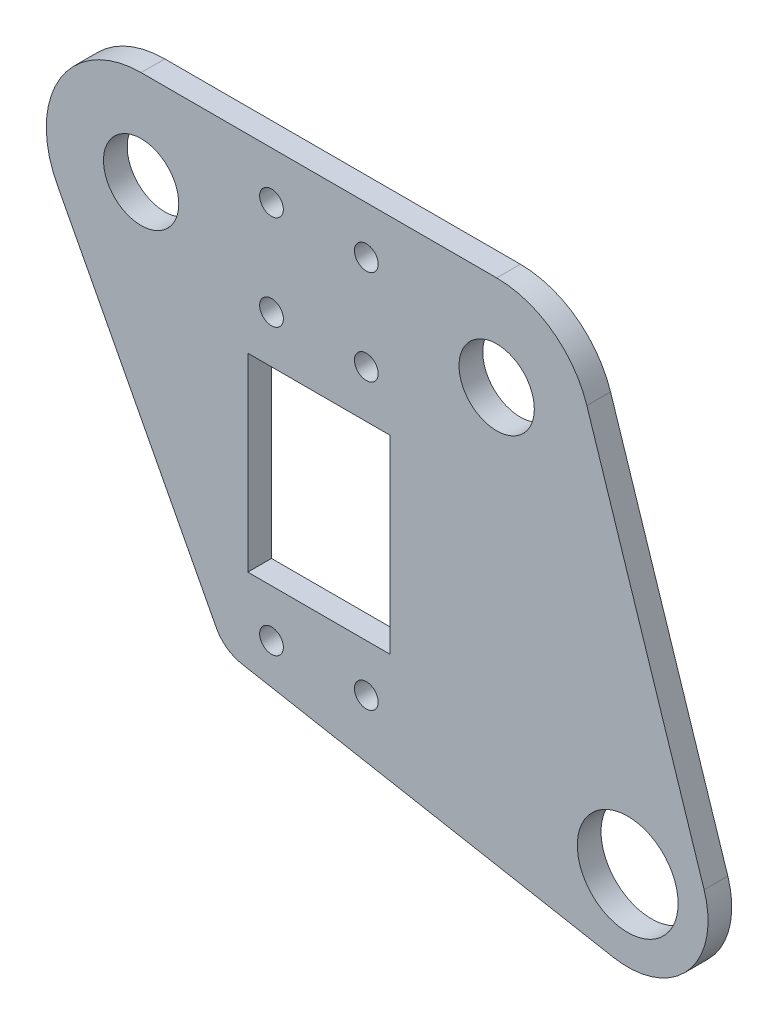
ISO-10303-21;
HEADER;
FILE_DESCRIPTION(('STEP AP214'),'2;1');
FILE_NAME('part.step','',(''),(''),'','','');
FILE_SCHEMA(('AUTOMOTIVE_DESIGN { 1 0 10303 214 1 1 1 1 }'));
ENDSEC;
DATA;
#1=APPLICATION_CONTEXT('core data for automotive mechanical design processes');
#2=APPLICATION_PROTOCOL_DEFINITION('international standard','automotive_design',2000,#1);
#3=PRODUCT_CONTEXT('',#1,'mechanical');
#4=PRODUCT('Part','Part','',(#3));
#5=PRODUCT_RELATED_PRODUCT_CATEGORY('part','',(#4));
#6=PRODUCT_DEFINITION_FORMATION('','',#4);
#7=PRODUCT_DEFINITION_CONTEXT('part definition',#1,'design');
#8=PRODUCT_DEFINITION('design','',#6,#7);
#9=PRODUCT_DEFINITION_SHAPE('','',#8);
#10=(LENGTH_UNIT() NAMED_UNIT(*) SI_UNIT(.MILLI.,.METRE.));
#11=(NAMED_UNIT(*) PLANE_ANGLE_UNIT() SI_UNIT($,.RADIAN.));
#12=(NAMED_UNIT(*) SI_UNIT($,.STERADIAN.) SOLID_ANGLE_UNIT());
#13=UNCERTAINTY_MEASURE_WITH_UNIT(LENGTH_MEASURE(1.E-05),#10,'distance_accuracy_value','');
#14=(GEOMETRIC_REPRESENTATION_CONTEXT(3) GLOBAL_UNCERTAINTY_ASSIGNED_CONTEXT((#13)) GLOBAL_UNIT_ASSIGNED_CONTEXT((#10,
#11,#12)) REPRESENTATION_CONTEXT('',''));
#15=CARTESIAN_POINT('',(0.,0.,0.));
#16=DIRECTION('',(0.,0.,1.));
#17=DIRECTION('',(1.,0.,0.));
#18=AXIS2_PLACEMENT_3D('',#15,#16,#17);
#19=CARTESIAN_POINT('',(-23.8125,0.,3.175));
#20=DIRECTION('',(0.,0.,1.));
#21=DIRECTION('',(1.,0.,0.));
#22=AXIS2_PLACEMENT_3D('',#19,#20,#21);
#23=PLANE('',#22);
#24=CARTESIAN_POINT('',(6.35,-6.35,3.175));
#25=DIRECTION('',(0.,0.,1.));
#26=DIRECTION('',(1.,0.,0.));
#27=AXIS2_PLACEMENT_3D('',#24,#25,#26);
#28=CIRCLE('',#27,1.5875);
#29=CARTESIAN_POINT('',(7.9375,-6.35,3.175));
#30=VERTEX_POINT('',#29);
#31=EDGE_CURVE('E331',#30,#30,#28,.T.);
#32=ORIENTED_EDGE('',*,*,#31,.F.);
#33=EDGE_LOOP('',(#32));
#34=FACE_BOUND('',#33,.T.);
#35=CARTESIAN_POINT('',(-6.35,6.35,3.175));
#36=DIRECTION('',(0.,0.,1.));
#37=DIRECTION('',(1.,0.,0.));
#38=AXIS2_PLACEMENT_3D('',#35,#36,#37);
#39=CIRCLE('',#38,1.5875);
#40=CARTESIAN_POINT('',(-4.7625,6.35,3.175));
#41=VERTEX_POINT('',#40);
#42=EDGE_CURVE('E333',#41,#41,#39,.T.);
#43=ORIENTED_EDGE('',*,*,#42,.F.);
#44=EDGE_LOOP('',(#43));
#45=FACE_BOUND('',#44,.T.);
#46=CARTESIAN_POINT('',(-6.35,-6.35,3.175));
#47=DIRECTION('',(0.,0.,1.));
#48=DIRECTION('',(1.,0.,0.));
#49=AXIS2_PLACEMENT_3D('',#46,#47,#48);
#50=CIRCLE('',#49,1.5875);
#51=CARTESIAN_POINT('',(-4.7625,-6.35,3.175));
#52=VERTEX_POINT('',#51);
#53=EDGE_CURVE('E341',#52,#52,#50,.T.);
#54=ORIENTED_EDGE('',*,*,#53,.F.);
#55=EDGE_LOOP('',(#54));
#56=FACE_BOUND('',#55,.T.);
#57=CARTESIAN_POINT('',(6.35,6.35,3.175));
#58=DIRECTION('',(0.,0.,1.));
#59=DIRECTION('',(1.,0.,0.));
#60=AXIS2_PLACEMENT_3D('',#57,#58,#59);
#61=CIRCLE('',#60,1.5875);
#62=CARTESIAN_POINT('',(7.9375,6.35,3.175));
#63=VERTEX_POINT('',#62);
#64=EDGE_CURVE('E347',#63,#63,#61,.T.);
#65=ORIENTED_EDGE('',*,*,#64,.F.);
#66=EDGE_LOOP('',(#65));
#67=FACE_BOUND('',#66,.T.);
#68=CARTESIAN_POINT('',(-6.35,-44.45,3.175));
#69=DIRECTION('',(0.,0.,1.));
#70=DIRECTION('',(1.,0.,0.));
#71=AXIS2_PLACEMENT_3D('',#68,#69,#70);
#72=CIRCLE('',#71,1.5875);
#73=CARTESIAN_POINT('',(-4.7625,-44.45,3.175));
#74=VERTEX_POINT('',#73);
#75=EDGE_CURVE('E353',#74,#74,#72,.T.);
#76=ORIENTED_EDGE('',*,*,#75,.F.);
#77=EDGE_LOOP('',(#76));
#78=FACE_BOUND('',#77,.T.);
#79=CARTESIAN_POINT('',(6.35,-44.45,3.175));
#80=DIRECTION('',(0.,0.,1.));
#81=DIRECTION('',(1.,0.,0.));
#82=AXIS2_PLACEMENT_3D('',#79,#80,#81);
#83=CIRCLE('',#82,1.5875);
#84=CARTESIAN_POINT('',(7.9375,-44.45,3.175));
#85=VERTEX_POINT('',#84);
#86=EDGE_CURVE('E359',#85,#85,#83,.T.);
#87=ORIENTED_EDGE('',*,*,#86,.F.);
#88=EDGE_LOOP('',(#87));
#89=FACE_BOUND('',#88,.T.);
#90=CARTESIAN_POINT('',(41.3639,-47.7139,3.175));
#91=DIRECTION('',(0.,0.,1.));
#92=DIRECTION('',(1.,0.,0.));
#93=AXIS2_PLACEMENT_3D('',#90,#91,#92);
#94=CIRCLE('',#93,6.75);
#95=CARTESIAN_POINT('',(48.1139,-47.7139,3.175));
#96=VERTEX_POINT('',#95);
#97=EDGE_CURVE('E365',#96,#96,#94,.T.);
#98=ORIENTED_EDGE('',*,*,#97,.F.);
#99=EDGE_LOOP('',(#98));
#100=FACE_BOUND('',#99,.T.);
#101=CARTESIAN_POINT('',(-23.8125,0.,3.175));
#102=DIRECTION('',(0.,0.,1.));
#103=DIRECTION('',(1.,0.,0.));
#104=AXIS2_PLACEMENT_3D('',#101,#102,#103);
#105=CIRCLE('',#104,5.0419);
#106=CARTESIAN_POINT('',(-18.7706,0.,3.175));
#107=VERTEX_POINT('',#106);
#108=EDGE_CURVE('E371',#107,#107,#105,.T.);
#109=ORIENTED_EDGE('',*,*,#108,.F.);
#110=EDGE_LOOP('',(#109));
#111=FACE_BOUND('',#110,.T.);
#112=CARTESIAN_POINT('',(23.8125,0.,3.175));
#113=DIRECTION('',(0.,0.,1.));
#114=DIRECTION('',(1.,0.,0.));
#115=AXIS2_PLACEMENT_3D('',#112,#113,#114);
#116=CIRCLE('',#115,5.0419);
#117=CARTESIAN_POINT('',(28.8544,0.,3.175));
#118=VERTEX_POINT('',#117);
#119=EDGE_CURVE('E377',#118,#118,#116,.T.);
#120=ORIENTED_EDGE('',*,*,#119,.F.);
#121=EDGE_LOOP('',(#120));
#122=FACE_BOUND('',#121,.T.);
#123=CARTESIAN_POINT('',(-23.8125,0.,3.175));
#124=DIRECTION('',(0.,0.,1.));
#125=DIRECTION('',(1.,0.,0.));
#126=AXIS2_PLACEMENT_3D('',#123,#124,#125);
#127=CIRCLE('',#126,12.7);
#128=CARTESIAN_POINT('',(-23.8125,12.7,3.175));
#129=VERTEX_POINT('',#128);
#130=CARTESIAN_POINT('',(-35.0665660599883,-5.88523551928197,3.175));
#131=VERTEX_POINT('',#130);
#132=EDGE_CURVE('E159',#129,#131,#127,.T.);
#133=ORIENTED_EDGE('',*,*,#132,.T.);
#134=DIRECTION('',(0.463404371597006,-0.886146933857351,0.));
#135=VECTOR('',#134,1.);
#136=CARTESIAN_POINT('',(-35.0665660599883,-5.88523551928197,3.175));
#137=LINE('',#136,#135);
#138=CARTESIAN_POINT('',(-13.7452747724956,-46.6569633197307,3.175));
#139=VERTEX_POINT('',#138);
#140=EDGE_CURVE('E162',#131,#139,#137,.T.);
#141=ORIENTED_EDGE('',*,*,#140,.T.);
#142=CARTESIAN_POINT('',(-9.52499999999999,-44.45,3.175));
#143=DIRECTION('',(0.,0.,1.));
#144=DIRECTION('',(1.,0.,0.));
#145=AXIS2_PLACEMENT_3D('',#142,#143,#144);
#146=CIRCLE('',#145,4.7625);
#147=CARTESIAN_POINT('',(-10.3869292158251,-49.1338535712496,3.175));
#148=VERTEX_POINT('',#147);
#149=EDGE_CURVE('E165',#139,#148,#146,.T.);
#150=ORIENTED_EDGE('',*,*,#149,.T.);
#151=DIRECTION('',(0.983486314173133,-0.180982512509205,0.));
#152=VECTOR('',#151,1.);
#153=CARTESIAN_POINT('',(-10.3869292158251,-49.1338535712496,3.175));
#154=LINE('',#153,#152);
#155=CARTESIAN_POINT('',(39.4160757091197,-58.2986714562884,3.175));
#156=VERTEX_POINT('',#155);
#157=EDGE_CURVE('E167',#148,#156,#154,.T.);
#158=ORIENTED_EDGE('',*,*,#157,.T.);
#159=CARTESIAN_POINT('',(41.3639,-47.7139,3.175));
#160=DIRECTION('',(0.,0.,1.));
#161=DIRECTION('',(-1.,0.,0.));
#162=AXIS2_PLACEMENT_3D('',#159,#160,#161);
#163=CIRCLE('',#162,10.7625);
#164=CARTESIAN_POINT('',(51.598960290792,-44.3859956904003,3.175));
#165=VERTEX_POINT('',#164);
#166=EDGE_CURVE('E169',#156,#165,#163,.T.);
#167=ORIENTED_EDGE('',*,*,#166,.T.);
#168=DIRECTION('',(-0.309212943981386,0.950992826089852,0.));
#169=VECTOR('',#168,1.);
#170=CARTESIAN_POINT('',(35.8901088913411,3.9270043885636,3.175));
#171=LINE('',#170,#169);
#172=CARTESIAN_POINT('',(35.8901088913411,3.9270043885636,3.175));
#173=VERTEX_POINT('',#172);
#174=EDGE_CURVE('E171',#165,#173,#171,.T.);
#175=ORIENTED_EDGE('',*,*,#174,.T.);
#176=CARTESIAN_POINT('',(23.8125,0.,3.175));
#177=DIRECTION('',(0.,0.,1.));
#178=DIRECTION('',(-1.,0.,0.));
#179=AXIS2_PLACEMENT_3D('',#176,#177,#178);
#180=CIRCLE('',#179,12.7);
#181=CARTESIAN_POINT('',(23.8125,12.7,3.175));
#182=VERTEX_POINT('',#181);
#183=EDGE_CURVE('E173',#173,#182,#180,.T.);
#184=ORIENTED_EDGE('',*,*,#183,.T.);
#185=DIRECTION('',(-1.,0.,0.));
#186=VECTOR('',#185,1.);
#187=CARTESIAN_POINT('',(-23.8125,12.7,3.175));
#188=LINE('',#187,#186);
#189=EDGE_CURVE('E175',#182,#129,#188,.T.);
#190=ORIENTED_EDGE('',*,*,#189,.T.);
#191=EDGE_LOOP('',(#133,#141,#150,#158,#167,#175,#184,#190));
#192=FACE_BOUND('',#191,.T.);
#193=DIRECTION('',(1.,0.,0.));
#194=VECTOR('',#193,1.);
#195=CARTESIAN_POINT('',(-9.52499999999999,-38.1,3.175));
#196=LINE('',#195,#194);
#197=CARTESIAN_POINT('',(-9.52499999999999,-38.1,3.175));
#198=VERTEX_POINT('',#197);
#199=CARTESIAN_POINT('',(9.525,-38.1,3.175));
#200=VERTEX_POINT('',#199);
#201=EDGE_CURVE('E129',#198,#200,#196,.T.);
#202=ORIENTED_EDGE('',*,*,#201,.F.);
#203=DIRECTION('',(0.,-1.,0.));
#204=VECTOR('',#203,1.);
#205=CARTESIAN_POINT('',(-9.525,-12.7,3.175));
#206=LINE('',#205,#204);
#207=CARTESIAN_POINT('',(-9.525,-12.7,3.175));
#208=VERTEX_POINT('',#207);
#209=EDGE_CURVE('E121',#208,#198,#206,.T.);
#210=ORIENTED_EDGE('',*,*,#209,.F.);
#211=DIRECTION('',(-1.,0.,0.));
#212=VECTOR('',#211,1.);
#213=CARTESIAN_POINT('',(-9.525,-12.7,3.175));
#214=LINE('',#213,#212);
#215=CARTESIAN_POINT('',(9.52500000000001,-12.7,3.175));
#216=VERTEX_POINT('',#215);
#217=EDGE_CURVE('E143',#216,#208,#214,.T.);
#218=ORIENTED_EDGE('',*,*,#217,.F.);
#219=DIRECTION('',(0.,1.,0.));
#220=VECTOR('',#219,1.);
#221=CARTESIAN_POINT('',(9.525,-12.7,3.175));
#222=LINE('',#221,#220);
#223=EDGE_CURVE('E141',#200,#216,#222,.T.);
#224=ORIENTED_EDGE('',*,*,#223,.F.);
#225=EDGE_LOOP('',(#202,#210,#218,#224));
#226=FACE_BOUND('',#225,.T.);
#227=ADVANCED_FACE('F32',(#34,#45,#56,#67,#78,#89,#100,#111,#122,#192,#226),#23,.T.);
#228=CARTESIAN_POINT('',(-23.8125,0.,0.));
#229=DIRECTION('',(0.,0.,1.));
#230=DIRECTION('',(1.,0.,0.));
#231=AXIS2_PLACEMENT_3D('',#228,#229,#230);
#232=PLANE('',#231);
#233=CARTESIAN_POINT('',(6.35,-6.35,0.));
#234=DIRECTION('',(0.,0.,1.));
#235=DIRECTION('',(1.,0.,0.));
#236=AXIS2_PLACEMENT_3D('',#233,#234,#235);
#237=CIRCLE('',#236,1.5875);
#238=CARTESIAN_POINT('',(7.9375,-6.35,0.));
#239=VERTEX_POINT('',#238);
#240=EDGE_CURVE('E329',#239,#239,#237,.T.);
#241=ORIENTED_EDGE('',*,*,#240,.T.);
#242=EDGE_LOOP('',(#241));
#243=FACE_BOUND('',#242,.T.);
#244=CARTESIAN_POINT('',(-6.35,6.35,0.));
#245=DIRECTION('',(0.,0.,1.));
#246=DIRECTION('',(1.,0.,0.));
#247=AXIS2_PLACEMENT_3D('',#244,#245,#246);
#248=CIRCLE('',#247,1.5875);
#249=CARTESIAN_POINT('',(-4.7625,6.35,0.));
#250=VERTEX_POINT('',#249);
#251=EDGE_CURVE('E338',#250,#250,#248,.T.);
#252=ORIENTED_EDGE('',*,*,#251,.T.);
#253=EDGE_LOOP('',(#252));
#254=FACE_BOUND('',#253,.T.);
#255=CARTESIAN_POINT('',(-6.35,-6.35,0.));
#256=DIRECTION('',(0.,0.,1.));
#257=DIRECTION('',(1.,0.,0.));
#258=AXIS2_PLACEMENT_3D('',#255,#256,#257);
#259=CIRCLE('',#258,1.5875);
#260=CARTESIAN_POINT('',(-4.7625,-6.35,0.));
#261=VERTEX_POINT('',#260);
#262=EDGE_CURVE('E344',#261,#261,#259,.T.);
#263=ORIENTED_EDGE('',*,*,#262,.T.);
#264=EDGE_LOOP('',(#263));
#265=FACE_BOUND('',#264,.T.);
#266=CARTESIAN_POINT('',(6.35,6.35,0.));
#267=DIRECTION('',(0.,0.,1.));
#268=DIRECTION('',(1.,0.,0.));
#269=AXIS2_PLACEMENT_3D('',#266,#267,#268);
#270=CIRCLE('',#269,1.5875);
#271=CARTESIAN_POINT('',(7.9375,6.35,0.));
#272=VERTEX_POINT('',#271);
#273=EDGE_CURVE('E350',#272,#272,#270,.T.);
#274=ORIENTED_EDGE('',*,*,#273,.T.);
#275=EDGE_LOOP('',(#274));
#276=FACE_BOUND('',#275,.T.);
#277=CARTESIAN_POINT('',(-6.35,-44.45,0.));
#278=DIRECTION('',(0.,0.,1.));
#279=DIRECTION('',(1.,0.,0.));
#280=AXIS2_PLACEMENT_3D('',#277,#278,#279);
#281=CIRCLE('',#280,1.5875);
#282=CARTESIAN_POINT('',(-4.7625,-44.45,0.));
#283=VERTEX_POINT('',#282);
#284=EDGE_CURVE('E356',#283,#283,#281,.T.);
#285=ORIENTED_EDGE('',*,*,#284,.T.);
#286=EDGE_LOOP('',(#285));
#287=FACE_BOUND('',#286,.T.);
#288=CARTESIAN_POINT('',(6.35,-44.45,0.));
#289=DIRECTION('',(0.,0.,1.));
#290=DIRECTION('',(1.,0.,0.));
#291=AXIS2_PLACEMENT_3D('',#288,#289,#290);
#292=CIRCLE('',#291,1.5875);
#293=CARTESIAN_POINT('',(7.9375,-44.45,0.));
#294=VERTEX_POINT('',#293);
#295=EDGE_CURVE('E362',#294,#294,#292,.T.);
#296=ORIENTED_EDGE('',*,*,#295,.T.);
#297=EDGE_LOOP('',(#296));
#298=FACE_BOUND('',#297,.T.);
#299=CARTESIAN_POINT('',(41.3639,-47.7139,0.));
#300=DIRECTION('',(0.,0.,1.));
#301=DIRECTION('',(1.,0.,0.));
#302=AXIS2_PLACEMENT_3D('',#299,#300,#301);
#303=CIRCLE('',#302,6.75);
#304=CARTESIAN_POINT('',(48.1139,-47.7139,0.));
#305=VERTEX_POINT('',#304);
#306=EDGE_CURVE('E368',#305,#305,#303,.T.);
#307=ORIENTED_EDGE('',*,*,#306,.T.);
#308=EDGE_LOOP('',(#307));
#309=FACE_BOUND('',#308,.T.);
#310=CARTESIAN_POINT('',(-23.8125,0.,0.));
#311=DIRECTION('',(0.,0.,1.));
#312=DIRECTION('',(1.,0.,0.));
#313=AXIS2_PLACEMENT_3D('',#310,#311,#312);
#314=CIRCLE('',#313,5.04189999999999);
#315=CARTESIAN_POINT('',(-18.7706,0.,0.));
#316=VERTEX_POINT('',#315);
#317=EDGE_CURVE('E374',#316,#316,#314,.T.);
#318=ORIENTED_EDGE('',*,*,#317,.T.);
#319=EDGE_LOOP('',(#318));
#320=FACE_BOUND('',#319,.T.);
#321=CARTESIAN_POINT('',(23.8125,0.,0.));
#322=DIRECTION('',(0.,0.,1.));
#323=DIRECTION('',(1.,0.,0.));
#324=AXIS2_PLACEMENT_3D('',#321,#322,#323);
#325=CIRCLE('',#324,5.04189999999999);
#326=CARTESIAN_POINT('',(28.8544,0.,0.));
#327=VERTEX_POINT('',#326);
#328=EDGE_CURVE('E149',#327,#327,#325,.T.);
#329=ORIENTED_EDGE('',*,*,#328,.T.);
#330=EDGE_LOOP('',(#329));
#331=FACE_BOUND('',#330,.T.);
#332=CARTESIAN_POINT('',(-23.8125,0.,0.));
#333=DIRECTION('',(0.,0.,1.));
#334=DIRECTION('',(1.,0.,0.));
#335=AXIS2_PLACEMENT_3D('',#332,#333,#334);
#336=CIRCLE('',#335,12.7);
#337=CARTESIAN_POINT('',(-23.8125,12.7,0.));
#338=VERTEX_POINT('',#337);
#339=CARTESIAN_POINT('',(-35.0665660599883,-5.88523551928197,0.));
#340=VERTEX_POINT('',#339);
#341=EDGE_CURVE('E137',#338,#340,#336,.T.);
#342=ORIENTED_EDGE('',*,*,#341,.F.);
#343=DIRECTION('',(-1.,0.,0.));
#344=VECTOR('',#343,1.);
#345=CARTESIAN_POINT('',(-23.8125,12.7,0.));
#346=LINE('',#345,#344);
#347=CARTESIAN_POINT('',(23.8125,12.7,0.));
#348=VERTEX_POINT('',#347);
#349=EDGE_CURVE('E163',#348,#338,#346,.T.);
#350=ORIENTED_EDGE('',*,*,#349,.F.);
#351=CARTESIAN_POINT('',(23.8125,0.,0.));
#352=DIRECTION('',(0.,0.,1.));
#353=DIRECTION('',(-1.,0.,0.));
#354=AXIS2_PLACEMENT_3D('',#351,#352,#353);
#355=CIRCLE('',#354,12.7);
#356=CARTESIAN_POINT('',(35.8901088913411,3.9270043885636,0.));
#357=VERTEX_POINT('',#356);
#358=EDGE_CURVE('E190',#357,#348,#355,.T.);
#359=ORIENTED_EDGE('',*,*,#358,.F.);
#360=DIRECTION('',(-0.309212943981386,0.950992826089852,0.));
#361=VECTOR('',#360,1.);
#362=CARTESIAN_POINT('',(35.8901088913411,3.9270043885636,0.));
#363=LINE('',#362,#361);
#364=CARTESIAN_POINT('',(51.598960290792,-44.3859956904003,0.));
#365=VERTEX_POINT('',#364);
#366=EDGE_CURVE('E188',#365,#357,#363,.T.);
#367=ORIENTED_EDGE('',*,*,#366,.F.);
#368=CARTESIAN_POINT('',(41.3639,-47.7139,0.));
#369=DIRECTION('',(0.,0.,1.));
#370=DIRECTION('',(-1.,0.,0.));
#371=AXIS2_PLACEMENT_3D('',#368,#369,#370);
#372=CIRCLE('',#371,10.7625);
#373=CARTESIAN_POINT('',(39.4160757091197,-58.2986714562884,0.));
#374=VERTEX_POINT('',#373);
#375=EDGE_CURVE('E186',#374,#365,#372,.T.);
#376=ORIENTED_EDGE('',*,*,#375,.F.);
#377=DIRECTION('',(0.983486314173133,-0.180982512509205,0.));
#378=VECTOR('',#377,1.);
#379=CARTESIAN_POINT('',(-10.3869292158251,-49.1338535712496,0.));
#380=LINE('',#379,#378);
#381=CARTESIAN_POINT('',(-10.3869292158251,-49.1338535712496,0.));
#382=VERTEX_POINT('',#381);
#383=EDGE_CURVE('E184',#382,#374,#380,.T.);
#384=ORIENTED_EDGE('',*,*,#383,.F.);
#385=CARTESIAN_POINT('',(-9.52499999999999,-44.45,0.));
#386=DIRECTION('',(0.,0.,1.));
#387=DIRECTION('',(1.,0.,0.));
#388=AXIS2_PLACEMENT_3D('',#385,#386,#387);
#389=CIRCLE('',#388,4.7625);
#390=CARTESIAN_POINT('',(-13.7452747724956,-46.6569633197307,0.));
#391=VERTEX_POINT('',#390);
#392=EDGE_CURVE('E182',#391,#382,#389,.T.);
#393=ORIENTED_EDGE('',*,*,#392,.F.);
#394=DIRECTION('',(0.463404371597006,-0.886146933857351,0.));
#395=VECTOR('',#394,1.);
#396=CARTESIAN_POINT('',(-35.0665660599883,-5.88523551928197,0.));
#397=LINE('',#396,#395);
#398=EDGE_CURVE('E180',#340,#391,#397,.T.);
#399=ORIENTED_EDGE('',*,*,#398,.F.);
#400=EDGE_LOOP('',(#342,#350,#359,#367,#376,#384,#393,#399));
#401=FACE_BOUND('',#400,.T.);
#402=DIRECTION('',(0.,-1.,0.));
#403=VECTOR('',#402,1.);
#404=CARTESIAN_POINT('',(-9.525,-12.7,0.));
#405=LINE('',#404,#403);
#406=CARTESIAN_POINT('',(-9.525,-12.7,0.));
#407=VERTEX_POINT('',#406);
#408=CARTESIAN_POINT('',(-9.52499999999999,-38.1,0.));
#409=VERTEX_POINT('',#408);
#410=EDGE_CURVE('E55',#407,#409,#405,.T.);
#411=ORIENTED_EDGE('',*,*,#410,.T.);
#412=DIRECTION('',(1.,0.,0.));
#413=VECTOR('',#412,1.);
#414=CARTESIAN_POINT('',(-9.52499999999999,-38.1,0.));
#415=LINE('',#414,#413);
#416=CARTESIAN_POINT('',(9.525,-38.1,0.));
#417=VERTEX_POINT('',#416);
#418=EDGE_CURVE('E136',#409,#417,#415,.T.);
#419=ORIENTED_EDGE('',*,*,#418,.T.);
#420=DIRECTION('',(0.,1.,0.));
#421=VECTOR('',#420,1.);
#422=CARTESIAN_POINT('',(9.525,-12.7,0.));
#423=LINE('',#422,#421);
#424=CARTESIAN_POINT('',(9.525,-12.7,0.));
#425=VERTEX_POINT('',#424);
#426=EDGE_CURVE('E151',#417,#425,#423,.T.);
#427=ORIENTED_EDGE('',*,*,#426,.T.);
#428=DIRECTION('',(-1.,0.,0.));
#429=VECTOR('',#428,1.);
#430=CARTESIAN_POINT('',(-9.525,-12.7,0.));
#431=LINE('',#430,#429);
#432=EDGE_CURVE('E130',#425,#407,#431,.T.);
#433=ORIENTED_EDGE('',*,*,#432,.T.);
#434=EDGE_LOOP('',(#411,#419,#427,#433));
#435=FACE_BOUND('',#434,.T.);
#436=ADVANCED_FACE('F220',(#243,#254,#265,#276,#287,#298,#309,#320,#331,#401,#435),#232,.F.);
#437=CARTESIAN_POINT('',(-23.8125,0.,3.175));
#438=DIRECTION('',(0.,0.,-1.));
#439=DIRECTION('',(-1.,0.,0.));
#440=AXIS2_PLACEMENT_3D('',#437,#438,#439);
#441=CYLINDRICAL_SURFACE('',#440,12.7);
#442=ORIENTED_EDGE('',*,*,#341,.T.);
#443=DIRECTION('',(0.,0.,-1.));
#444=VECTOR('',#443,1.);
#445=CARTESIAN_POINT('',(-35.0665660599883,-5.88523551928197,3.175));
#446=LINE('',#445,#444);
#447=EDGE_CURVE('E11',#131,#340,#446,.T.);
#448=ORIENTED_EDGE('',*,*,#447,.F.);
#449=ORIENTED_EDGE('',*,*,#132,.F.);
#450=DIRECTION('',(0.,0.,-1.));
#451=VECTOR('',#450,1.);
#452=CARTESIAN_POINT('',(-23.8125,12.7,3.175));
#453=LINE('',#452,#451);
#454=EDGE_CURVE('E177',#129,#338,#453,.T.);
#455=ORIENTED_EDGE('',*,*,#454,.T.);
#456=EDGE_LOOP('',(#442,#448,#449,#455));
#457=FACE_BOUND('',#456,.T.);
#458=ADVANCED_FACE('F34',(#457),#441,.T.);
#459=CARTESIAN_POINT('',(-35.0665660599883,-5.88523551928197,3.175));
#460=DIRECTION('',(0.886146933857351,0.463404371597006,0.));
#461=DIRECTION('',(-0.463404371597006,0.886146933857351,0.));
#462=AXIS2_PLACEMENT_3D('',#459,#460,#461);
#463=PLANE('',#462);
#464=ORIENTED_EDGE('',*,*,#398,.T.);
#465=DIRECTION('',(0.,0.,-1.));
#466=VECTOR('',#465,1.);
#467=CARTESIAN_POINT('',(-13.7452747724956,-46.6569633197307,3.175));
#468=LINE('',#467,#466);
#469=EDGE_CURVE('E40',#139,#391,#468,.T.);
#470=ORIENTED_EDGE('',*,*,#469,.F.);
#471=ORIENTED_EDGE('',*,*,#140,.F.);
#472=ORIENTED_EDGE('',*,*,#447,.T.);
#473=EDGE_LOOP('',(#464,#470,#471,#472));
#474=FACE_BOUND('',#473,.T.);
#475=ADVANCED_FACE('F237',(#474),#463,.F.);
#476=CARTESIAN_POINT('',(-9.52499999999999,-44.45,3.175));
#477=DIRECTION('',(0.,0.,-1.));
#478=DIRECTION('',(-1.,0.,0.));
#479=AXIS2_PLACEMENT_3D('',#476,#477,#478);
#480=CYLINDRICAL_SURFACE('',#479,4.7625);
#481=ORIENTED_EDGE('',*,*,#392,.T.);
#482=DIRECTION('',(0.,0.,-1.));
#483=VECTOR('',#482,1.);
#484=CARTESIAN_POINT('',(-10.3869292158251,-49.1338535712496,3.175));
#485=LINE('',#484,#483);
#486=EDGE_CURVE('E207',#148,#382,#485,.T.);
#487=ORIENTED_EDGE('',*,*,#486,.F.);
#488=ORIENTED_EDGE('',*,*,#149,.F.);
#489=ORIENTED_EDGE('',*,*,#469,.T.);
#490=EDGE_LOOP('',(#481,#487,#488,#489));
#491=FACE_BOUND('',#490,.T.);
#492=ADVANCED_FACE('F214',(#491),#480,.T.);
#493=CARTESIAN_POINT('',(-10.3869292158251,-49.1338535712496,3.175));
#494=DIRECTION('',(0.180982512509205,0.983486314173133,0.));
#495=DIRECTION('',(-0.983486314173133,0.180982512509205,0.));
#496=AXIS2_PLACEMENT_3D('',#493,#494,#495);
#497=PLANE('',#496);
#498=ORIENTED_EDGE('',*,*,#383,.T.);
#499=DIRECTION('',(0.,0.,-1.));
#500=VECTOR('',#499,1.);
#501=CARTESIAN_POINT('',(39.4160757091197,-58.2986714562884,3.175));
#502=LINE('',#501,#500);
#503=EDGE_CURVE('E204',#156,#374,#502,.T.);
#504=ORIENTED_EDGE('',*,*,#503,.F.);
#505=ORIENTED_EDGE('',*,*,#157,.F.);
#506=ORIENTED_EDGE('',*,*,#486,.T.);
#507=EDGE_LOOP('',(#498,#504,#505,#506));
#508=FACE_BOUND('',#507,.T.);
#509=ADVANCED_FACE('F226',(#508),#497,.F.);
#510=CARTESIAN_POINT('',(41.3639,-47.7139,3.175));
#511=DIRECTION('',(0.,0.,-1.));
#512=DIRECTION('',(-1.,0.,0.));
#513=AXIS2_PLACEMENT_3D('',#510,#511,#512);
#514=CYLINDRICAL_SURFACE('',#513,10.7625);
#515=ORIENTED_EDGE('',*,*,#375,.T.);
#516=DIRECTION('',(0.,0.,-1.));
#517=VECTOR('',#516,1.);
#518=CARTESIAN_POINT('',(51.598960290792,-44.3859956904003,3.175));
#519=LINE('',#518,#517);
#520=EDGE_CURVE('E201',#165,#365,#519,.T.);
#521=ORIENTED_EDGE('',*,*,#520,.F.);
#522=ORIENTED_EDGE('',*,*,#166,.F.);
#523=ORIENTED_EDGE('',*,*,#503,.T.);
#524=EDGE_LOOP('',(#515,#521,#522,#523));
#525=FACE_BOUND('',#524,.T.);
#526=ADVANCED_FACE('F230',(#525),#514,.T.);
#527=CARTESIAN_POINT('',(35.8901088913411,3.9270043885636,3.175));
#528=DIRECTION('',(-0.950992826089852,-0.309212943981386,0.));
#529=DIRECTION('',(0.309212943981386,-0.950992826089852,0.));
#530=AXIS2_PLACEMENT_3D('',#527,#528,#529);
#531=PLANE('',#530);
#532=ORIENTED_EDGE('',*,*,#366,.T.);
#533=DIRECTION('',(0.,0.,-1.));
#534=VECTOR('',#533,1.);
#535=CARTESIAN_POINT('',(35.8901088913411,3.9270043885636,3.175));
#536=LINE('',#535,#534);
#537=EDGE_CURVE('E198',#173,#357,#536,.T.);
#538=ORIENTED_EDGE('',*,*,#537,.F.);
#539=ORIENTED_EDGE('',*,*,#174,.F.);
#540=ORIENTED_EDGE('',*,*,#520,.T.);
#541=EDGE_LOOP('',(#532,#538,#539,#540));
#542=FACE_BOUND('',#541,.T.);
#543=ADVANCED_FACE('F250',(#542),#531,.F.);
#544=CARTESIAN_POINT('',(23.8125,0.,3.175));
#545=DIRECTION('',(0.,0.,-1.));
#546=DIRECTION('',(-1.,0.,0.));
#547=AXIS2_PLACEMENT_3D('',#544,#545,#546);
#548=CYLINDRICAL_SURFACE('',#547,12.7);
#549=ORIENTED_EDGE('',*,*,#358,.T.);
#550=DIRECTION('',(0.,0.,-1.));
#551=VECTOR('',#550,1.);
#552=CARTESIAN_POINT('',(23.8125,12.7,3.175));
#553=LINE('',#552,#551);
#554=EDGE_CURVE('E195',#182,#348,#553,.T.);
#555=ORIENTED_EDGE('',*,*,#554,.F.);
#556=ORIENTED_EDGE('',*,*,#183,.F.);
#557=ORIENTED_EDGE('',*,*,#537,.T.);
#558=EDGE_LOOP('',(#549,#555,#556,#557));
#559=FACE_BOUND('',#558,.T.);
#560=ADVANCED_FACE('F248',(#559),#548,.T.);
#561=CARTESIAN_POINT('',(-23.8125,12.7,3.175));
#562=DIRECTION('',(0.,-1.,0.));
#563=DIRECTION('',(1.,0.,0.));
#564=AXIS2_PLACEMENT_3D('',#561,#562,#563);
#565=PLANE('',#564);
#566=ORIENTED_EDGE('',*,*,#349,.T.);
#567=ORIENTED_EDGE('',*,*,#454,.F.);
#568=ORIENTED_EDGE('',*,*,#189,.F.);
#569=ORIENTED_EDGE('',*,*,#554,.T.);
#570=EDGE_LOOP('',(#566,#567,#568,#569));
#571=FACE_BOUND('',#570,.T.);
#572=ADVANCED_FACE('F243',(#571),#565,.F.);
#573=CARTESIAN_POINT('',(-9.525,-12.7,3.175));
#574=DIRECTION('',(1.,0.,0.));
#575=DIRECTION('',(0.,1.,0.));
#576=AXIS2_PLACEMENT_3D('',#573,#574,#575);
#577=PLANE('',#576);
#578=ORIENTED_EDGE('',*,*,#410,.F.);
#579=DIRECTION('',(0.,0.,-1.));
#580=VECTOR('',#579,1.);
#581=CARTESIAN_POINT('',(-9.525,-12.7,3.175));
#582=LINE('',#581,#580);
#583=EDGE_CURVE('E125',#208,#407,#582,.T.);
#584=ORIENTED_EDGE('',*,*,#583,.F.);
#585=ORIENTED_EDGE('',*,*,#209,.T.);
#586=DIRECTION('',(0.,0.,-1.));
#587=VECTOR('',#586,1.);
#588=CARTESIAN_POINT('',(-9.52499999999999,-38.1,3.175));
#589=LINE('',#588,#587);
#590=EDGE_CURVE('E124',#198,#409,#589,.T.);
#591=ORIENTED_EDGE('',*,*,#590,.T.);
#592=EDGE_LOOP('',(#578,#584,#585,#591));
#593=FACE_BOUND('',#592,.T.);
#594=ADVANCED_FACE('F123',(#593),#577,.T.);
#595=CARTESIAN_POINT('',(-9.52499999999999,-38.1,3.175));
#596=DIRECTION('',(0.,1.,0.));
#597=DIRECTION('',(0.,0.,1.));
#598=AXIS2_PLACEMENT_3D('',#595,#596,#597);
#599=PLANE('',#598);
#600=ORIENTED_EDGE('',*,*,#418,.F.);
#601=ORIENTED_EDGE('',*,*,#590,.F.);
#602=ORIENTED_EDGE('',*,*,#201,.T.);
#603=DIRECTION('',(0.,0.,-1.));
#604=VECTOR('',#603,1.);
#605=CARTESIAN_POINT('',(9.525,-38.1,3.175));
#606=LINE('',#605,#604);
#607=EDGE_CURVE('E138',#200,#417,#606,.T.);
#608=ORIENTED_EDGE('',*,*,#607,.T.);
#609=EDGE_LOOP('',(#600,#601,#602,#608));
#610=FACE_BOUND('',#609,.T.);
#611=ADVANCED_FACE('F133',(#610),#599,.T.);
#612=CARTESIAN_POINT('',(9.525,-12.7,3.175));
#613=DIRECTION('',(-1.,0.,0.));
#614=DIRECTION('',(0.,0.,1.));
#615=AXIS2_PLACEMENT_3D('',#612,#613,#614);
#616=PLANE('',#615);
#617=ORIENTED_EDGE('',*,*,#426,.F.);
#618=ORIENTED_EDGE('',*,*,#607,.F.);
#619=ORIENTED_EDGE('',*,*,#223,.T.);
#620=DIRECTION('',(0.,0.,-1.));
#621=VECTOR('',#620,1.);
#622=CARTESIAN_POINT('',(9.525,-12.7,3.175));
#623=LINE('',#622,#621);
#624=EDGE_CURVE('E47',#216,#425,#623,.T.);
#625=ORIENTED_EDGE('',*,*,#624,.T.);
#626=EDGE_LOOP('',(#617,#618,#619,#625));
#627=FACE_BOUND('',#626,.T.);
#628=ADVANCED_FACE('F279',(#627),#616,.T.);
#629=CARTESIAN_POINT('',(-9.525,-12.7,3.175));
#630=DIRECTION('',(0.,-1.,0.));
#631=DIRECTION('',(1.,0.,0.));
#632=AXIS2_PLACEMENT_3D('',#629,#630,#631);
#633=PLANE('',#632);
#634=ORIENTED_EDGE('',*,*,#432,.F.);
#635=ORIENTED_EDGE('',*,*,#624,.F.);
#636=ORIENTED_EDGE('',*,*,#217,.T.);
#637=ORIENTED_EDGE('',*,*,#583,.T.);
#638=EDGE_LOOP('',(#634,#635,#636,#637));
#639=FACE_BOUND('',#638,.T.);
#640=ADVANCED_FACE('F283',(#639),#633,.T.);
#641=CARTESIAN_POINT('',(23.8125,0.,3.175));
#642=DIRECTION('',(0.,0.,1.));
#643=DIRECTION('',(1.,0.,0.));
#644=AXIS2_PLACEMENT_3D('',#641,#642,#643);
#645=CYLINDRICAL_SURFACE('',#644,5.0419);
#646=ORIENTED_EDGE('',*,*,#328,.F.);
#647=EDGE_LOOP('',(#646));
#648=FACE_BOUND('',#647,.T.);
#649=ORIENTED_EDGE('',*,*,#119,.T.);
#650=EDGE_LOOP('',(#649));
#651=FACE_BOUND('',#650,.T.);
#652=ADVANCED_FACE('F289',(#648,#651),#645,.F.);
#653=CARTESIAN_POINT('',(-23.8125,0.,3.175));
#654=DIRECTION('',(0.,0.,1.));
#655=DIRECTION('',(1.,0.,0.));
#656=AXIS2_PLACEMENT_3D('',#653,#654,#655);
#657=CYLINDRICAL_SURFACE('',#656,5.0419);
#658=ORIENTED_EDGE('',*,*,#317,.F.);
#659=EDGE_LOOP('',(#658));
#660=FACE_BOUND('',#659,.T.);
#661=ORIENTED_EDGE('',*,*,#108,.T.);
#662=EDGE_LOOP('',(#661));
#663=FACE_BOUND('',#662,.T.);
#664=ADVANCED_FACE('F292',(#660,#663),#657,.F.);
#665=CARTESIAN_POINT('',(41.3639,-47.7139,3.175));
#666=DIRECTION('',(0.,0.,1.));
#667=DIRECTION('',(1.,0.,0.));
#668=AXIS2_PLACEMENT_3D('',#665,#666,#667);
#669=CYLINDRICAL_SURFACE('',#668,6.75);
#670=ORIENTED_EDGE('',*,*,#306,.F.);
#671=EDGE_LOOP('',(#670));
#672=FACE_BOUND('',#671,.T.);
#673=ORIENTED_EDGE('',*,*,#97,.T.);
#674=EDGE_LOOP('',(#673));
#675=FACE_BOUND('',#674,.T.);
#676=ADVANCED_FACE('F296',(#672,#675),#669,.F.);
#677=CARTESIAN_POINT('',(6.35,-44.45,3.175));
#678=DIRECTION('',(0.,0.,1.));
#679=DIRECTION('',(1.,0.,0.));
#680=AXIS2_PLACEMENT_3D('',#677,#678,#679);
#681=CYLINDRICAL_SURFACE('',#680,1.5875);
#682=ORIENTED_EDGE('',*,*,#295,.F.);
#683=EDGE_LOOP('',(#682));
#684=FACE_BOUND('',#683,.T.);
#685=ORIENTED_EDGE('',*,*,#86,.T.);
#686=EDGE_LOOP('',(#685));
#687=FACE_BOUND('',#686,.T.);
#688=ADVANCED_FACE('F300',(#684,#687),#681,.F.);
#689=CARTESIAN_POINT('',(-6.35,-44.45,3.175));
#690=DIRECTION('',(0.,0.,1.));
#691=DIRECTION('',(1.,0.,0.));
#692=AXIS2_PLACEMENT_3D('',#689,#690,#691);
#693=CYLINDRICAL_SURFACE('',#692,1.5875);
#694=ORIENTED_EDGE('',*,*,#284,.F.);
#695=EDGE_LOOP('',(#694));
#696=FACE_BOUND('',#695,.T.);
#697=ORIENTED_EDGE('',*,*,#75,.T.);
#698=EDGE_LOOP('',(#697));
#699=FACE_BOUND('',#698,.T.);
#700=ADVANCED_FACE('F304',(#696,#699),#693,.F.);
#701=CARTESIAN_POINT('',(6.35,6.35,3.175));
#702=DIRECTION('',(0.,0.,1.));
#703=DIRECTION('',(1.,0.,0.));
#704=AXIS2_PLACEMENT_3D('',#701,#702,#703);
#705=CYLINDRICAL_SURFACE('',#704,1.5875);
#706=ORIENTED_EDGE('',*,*,#273,.F.);
#707=EDGE_LOOP('',(#706));
#708=FACE_BOUND('',#707,.T.);
#709=ORIENTED_EDGE('',*,*,#64,.T.);
#710=EDGE_LOOP('',(#709));
#711=FACE_BOUND('',#710,.T.);
#712=ADVANCED_FACE('F308',(#708,#711),#705,.F.);
#713=CARTESIAN_POINT('',(-6.35,-6.35,3.175));
#714=DIRECTION('',(0.,0.,1.));
#715=DIRECTION('',(1.,0.,0.));
#716=AXIS2_PLACEMENT_3D('',#713,#714,#715);
#717=CYLINDRICAL_SURFACE('',#716,1.5875);
#718=ORIENTED_EDGE('',*,*,#262,.F.);
#719=EDGE_LOOP('',(#718));
#720=FACE_BOUND('',#719,.T.);
#721=ORIENTED_EDGE('',*,*,#53,.T.);
#722=EDGE_LOOP('',(#721));
#723=FACE_BOUND('',#722,.T.);
#724=ADVANCED_FACE('F312',(#720,#723),#717,.F.);
#725=CARTESIAN_POINT('',(-6.35,6.35,3.175));
#726=DIRECTION('',(0.,0.,1.));
#727=DIRECTION('',(1.,0.,0.));
#728=AXIS2_PLACEMENT_3D('',#725,#726,#727);
#729=CYLINDRICAL_SURFACE('',#728,1.5875);
#730=ORIENTED_EDGE('',*,*,#251,.F.);
#731=EDGE_LOOP('',(#730));
#732=FACE_BOUND('',#731,.T.);
#733=ORIENTED_EDGE('',*,*,#42,.T.);
#734=EDGE_LOOP('',(#733));
#735=FACE_BOUND('',#734,.T.);
#736=ADVANCED_FACE('F316',(#732,#735),#729,.F.);
#737=CARTESIAN_POINT('',(6.35,-6.35,3.175));
#738=DIRECTION('',(0.,0.,1.));
#739=DIRECTION('',(1.,0.,0.));
#740=AXIS2_PLACEMENT_3D('',#737,#738,#739);
#741=CYLINDRICAL_SURFACE('',#740,1.5875);
#742=ORIENTED_EDGE('',*,*,#240,.F.);
#743=EDGE_LOOP('',(#742));
#744=FACE_BOUND('',#743,.T.);
#745=ORIENTED_EDGE('',*,*,#31,.T.);
#746=EDGE_LOOP('',(#745));
#747=FACE_BOUND('',#746,.T.);
#748=ADVANCED_FACE('F320',(#744,#747),#741,.F.);
#749=CLOSED_SHELL('',(#227,#436,#458,#475,#492,#509,#526,#543,#560,#572,#594,#611,#628,#640,
#652,#664,#676,#688,#700,#712,#724,#736,#748));
#750=MANIFOLD_SOLID_BREP('B2',#749);
#751=ADVANCED_BREP_SHAPE_REPRESENTATION('',(#18,#750),#14);
#752=SHAPE_DEFINITION_REPRESENTATION(#9,#751);
ENDSEC;
END-ISO-10303-21;
